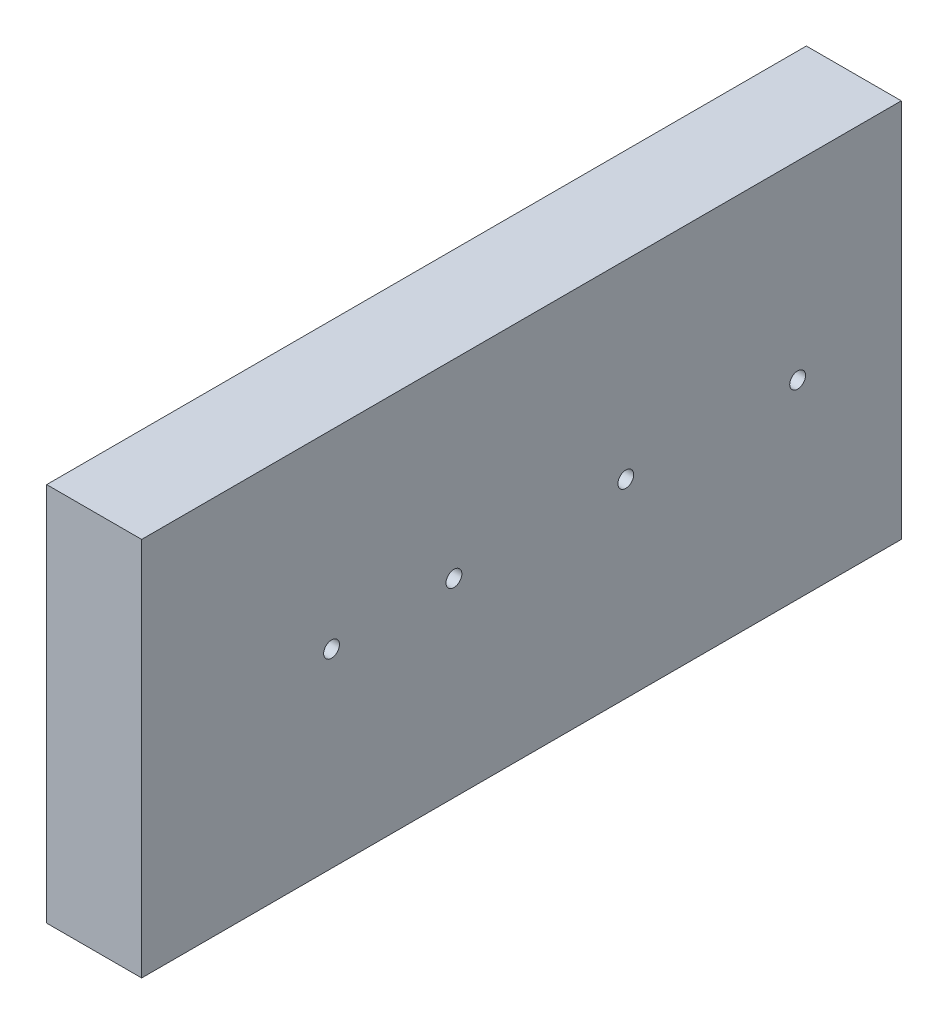
ISO-10303-21;
HEADER;
FILE_DESCRIPTION(('STEP AP214'),'2;1');
FILE_NAME('part.step','',(''),(''),'','','');
FILE_SCHEMA(('AUTOMOTIVE_DESIGN { 1 0 10303 214 1 1 1 1 }'));
ENDSEC;
DATA;
#1=APPLICATION_CONTEXT('core data for automotive mechanical design processes');
#2=APPLICATION_PROTOCOL_DEFINITION('international standard','automotive_design',2000,#1);
#3=PRODUCT_CONTEXT('',#1,'mechanical');
#4=PRODUCT('Part','Part','',(#3));
#5=PRODUCT_RELATED_PRODUCT_CATEGORY('part','',(#4));
#6=PRODUCT_DEFINITION_FORMATION('','',#4);
#7=PRODUCT_DEFINITION_CONTEXT('part definition',#1,'design');
#8=PRODUCT_DEFINITION('design','',#6,#7);
#9=PRODUCT_DEFINITION_SHAPE('','',#8);
#10=(LENGTH_UNIT() NAMED_UNIT(*) SI_UNIT(.MILLI.,.METRE.));
#11=(NAMED_UNIT(*) PLANE_ANGLE_UNIT() SI_UNIT($,.RADIAN.));
#12=(NAMED_UNIT(*) SI_UNIT($,.STERADIAN.) SOLID_ANGLE_UNIT());
#13=UNCERTAINTY_MEASURE_WITH_UNIT(LENGTH_MEASURE(1.E-05),#10,'distance_accuracy_value','');
#14=(GEOMETRIC_REPRESENTATION_CONTEXT(3) GLOBAL_UNCERTAINTY_ASSIGNED_CONTEXT((#13)) GLOBAL_UNIT_ASSIGNED_CONTEXT((#10,
#11,#12)) REPRESENTATION_CONTEXT('',''));
#15=CARTESIAN_POINT('',(0.,0.,0.));
#16=DIRECTION('',(0.,0.,1.));
#17=DIRECTION('',(1.,0.,0.));
#18=AXIS2_PLACEMENT_3D('',#15,#16,#17);
#19=CARTESIAN_POINT('',(19.05,0.,-20.927));
#20=DIRECTION('',(-1.,0.,0.));
#21=DIRECTION('',(0.,0.,1.));
#22=AXIS2_PLACEMENT_3D('',#19,#20,#21);
#23=CYLINDRICAL_SURFACE('',#22,1.5875);
#24=CARTESIAN_POINT('',(19.05,0.,-20.927));
#25=DIRECTION('',(1.,0.,0.));
#26=DIRECTION('',(0.,0.,-1.));
#27=AXIS2_PLACEMENT_3D('',#24,#25,#26);
#28=CIRCLE('',#27,1.5875);
#29=CARTESIAN_POINT('',(19.05,0.,-19.3395));
#30=VERTEX_POINT('',#29);
#31=EDGE_CURVE('E206',#30,#30,#28,.T.);
#32=CARTESIAN_POINT('',(6.35,0.,-20.927));
#33=DIRECTION('',(-1.,0.,0.));
#34=DIRECTION('',(0.,0.,1.));
#35=AXIS2_PLACEMENT_3D('',#32,#33,#34);
#36=CIRCLE('',#35,1.5875);
#37=CARTESIAN_POINT('',(6.35,0.,-19.3395));
#38=VERTEX_POINT('',#37);
#39=EDGE_CURVE('E55',#38,#38,#36,.T.);
#40=CARTESIAN_POINT('',(19.05,0.,-19.3395));
#41=CARTESIAN_POINT('',(18.9177083333333,0.,-19.3395));
#42=CARTESIAN_POINT('',(18.7854166666667,0.,-19.3395));
#43=CARTESIAN_POINT('',(18.5208333333333,0.,-19.3395));
#44=CARTESIAN_POINT('',(18.3885416666667,0.,-19.3395));
#45=CARTESIAN_POINT('',(18.1239583333333,0.,-19.3395));
#46=CARTESIAN_POINT('',(17.9916666666667,0.,-19.3395));
#47=CARTESIAN_POINT('',(17.7270833333333,0.,-19.3395));
#48=CARTESIAN_POINT('',(17.5947916666667,0.,-19.3395));
#49=CARTESIAN_POINT('',(17.3302083333333,0.,-19.3395));
#50=CARTESIAN_POINT('',(17.1979166666667,0.,-19.3395));
#51=CARTESIAN_POINT('',(16.9333333333333,0.,-19.3395));
#52=CARTESIAN_POINT('',(16.8010416666667,0.,-19.3395));
#53=CARTESIAN_POINT('',(16.5364583333333,0.,-19.3395));
#54=CARTESIAN_POINT('',(16.4041666666667,0.,-19.3395));
#55=CARTESIAN_POINT('',(16.1395833333333,0.,-19.3395));
#56=CARTESIAN_POINT('',(16.0072916666667,0.,-19.3395));
#57=CARTESIAN_POINT('',(15.7427083333333,0.,-19.3395));
#58=CARTESIAN_POINT('',(15.6104166666667,0.,-19.3395));
#59=CARTESIAN_POINT('',(15.3458333333333,0.,-19.3395));
#60=CARTESIAN_POINT('',(15.2135416666667,0.,-19.3395));
#61=CARTESIAN_POINT('',(14.9489583333333,0.,-19.3395));
#62=CARTESIAN_POINT('',(14.8166666666667,0.,-19.3395));
#63=CARTESIAN_POINT('',(14.5520833333333,0.,-19.3395));
#64=CARTESIAN_POINT('',(14.4197916666667,0.,-19.3395));
#65=CARTESIAN_POINT('',(14.1552083333333,0.,-19.3395));
#66=CARTESIAN_POINT('',(14.0229166666667,0.,-19.3395));
#67=CARTESIAN_POINT('',(13.7583333333333,0.,-19.3395));
#68=CARTESIAN_POINT('',(13.6260416666667,0.,-19.3395));
#69=CARTESIAN_POINT('',(13.3614583333333,0.,-19.3395));
#70=CARTESIAN_POINT('',(13.2291666666667,0.,-19.3395));
#71=CARTESIAN_POINT('',(12.9645833333333,0.,-19.3395));
#72=CARTESIAN_POINT('',(12.8322916666667,0.,-19.3395));
#73=CARTESIAN_POINT('',(12.5677083333333,0.,-19.3395));
#74=CARTESIAN_POINT('',(12.4354166666667,0.,-19.3395));
#75=CARTESIAN_POINT('',(12.1708333333333,0.,-19.3395));
#76=CARTESIAN_POINT('',(12.0385416666667,0.,-19.3395));
#77=CARTESIAN_POINT('',(11.7739583333333,0.,-19.3395));
#78=CARTESIAN_POINT('',(11.6416666666667,0.,-19.3395));
#79=CARTESIAN_POINT('',(11.3770833333333,0.,-19.3395));
#80=CARTESIAN_POINT('',(11.2447916666667,0.,-19.3395));
#81=CARTESIAN_POINT('',(10.9802083333333,0.,-19.3395));
#82=CARTESIAN_POINT('',(10.8479166666667,0.,-19.3395));
#83=CARTESIAN_POINT('',(10.5833333333333,0.,-19.3395));
#84=CARTESIAN_POINT('',(10.4510416666667,0.,-19.3395));
#85=CARTESIAN_POINT('',(10.1864583333333,0.,-19.3395));
#86=CARTESIAN_POINT('',(10.0541666666667,0.,-19.3395));
#87=CARTESIAN_POINT('',(9.78958333333333,0.,-19.3395));
#88=CARTESIAN_POINT('',(9.65729166666667,0.,-19.3395));
#89=CARTESIAN_POINT('',(9.39270833333333,0.,-19.3395));
#90=CARTESIAN_POINT('',(9.26041666666667,0.,-19.3395));
#91=CARTESIAN_POINT('',(8.99583333333333,0.,-19.3395));
#92=CARTESIAN_POINT('',(8.86354166666667,0.,-19.3395));
#93=CARTESIAN_POINT('',(8.59895833333333,0.,-19.3395));
#94=CARTESIAN_POINT('',(8.46666666666667,0.,-19.3395));
#95=CARTESIAN_POINT('',(8.20208333333333,0.,-19.3395));
#96=CARTESIAN_POINT('',(8.06979166666667,0.,-19.3395));
#97=CARTESIAN_POINT('',(7.80520833333333,0.,-19.3395));
#98=CARTESIAN_POINT('',(7.67291666666667,0.,-19.3395));
#99=CARTESIAN_POINT('',(7.40833333333333,0.,-19.3395));
#100=CARTESIAN_POINT('',(7.27604166666667,0.,-19.3395));
#101=CARTESIAN_POINT('',(7.01145833333333,0.,-19.3395));
#102=CARTESIAN_POINT('',(6.87916666666667,0.,-19.3395));
#103=CARTESIAN_POINT('',(6.61458333333333,0.,-19.3395));
#104=CARTESIAN_POINT('',(6.48229166666667,0.,-19.3395));
#105=CARTESIAN_POINT('',(6.35,0.,-19.3395));
#106=B_SPLINE_CURVE_WITH_KNOTS('',3,(#40,#41,#42,#43,#44,#45,#46,#47,#48,#49,#50,#51,#52,#53,
#54,#55,#56,#57,#58,#59,#60,#61,#62,#63,#64,#65,#66,#67,#68,#69,#70,#71,#72,#73,#74,#75,#76,#77,
#78,#79,#80,#81,#82,#83,#84,#85,#86,#87,#88,#89,#90,#91,#92,#93,#94,#95,#96,#97,#98,#99,#100,
#101,#102,#103,#104,#105),.UNSPECIFIED.,.F.,.F.,(4,2,2,2,2,2,2,2,2,2,2,2,2,2,2,2,2,2,2,2,2,2,2,
2,2,2,2,2,2,2,2,2,4),(0.,0.396875000000001,0.793750000000003,1.190625,1.5875,1.984375,2.38125,
2.778125,3.175,3.571875,3.96875,4.365625,4.7625,5.159375,5.55625,5.953125,6.35,6.746875,7.14375,
7.540625,7.9375,8.334375,8.73125,9.128125,9.525,9.921875,10.31875,10.715625,11.1125,11.509375,
11.90625,12.303125,12.7),.UNSPECIFIED.);
#107=EDGE_CURVE('BSEAM51',#30,#38,#106,.T.);
#108=ORIENTED_EDGE('',*,*,#31,.T.);
#109=ORIENTED_EDGE('',*,*,#39,.T.);
#110=ORIENTED_EDGE('',*,*,#107,.T.);
#111=ORIENTED_EDGE('',*,*,#107,.F.);
#112=EDGE_LOOP('',(#108,#110,#109,#111));
#113=FACE_BOUND('',#112,.T.);
#114=ADVANCED_FACE('F51',(#113),#23,.F.);
#115=CARTESIAN_POINT('',(19.05,0.,13.55));
#116=DIRECTION('',(-1.,0.,0.));
#117=DIRECTION('',(0.,0.,1.));
#118=AXIS2_PLACEMENT_3D('',#115,#116,#117);
#119=CYLINDRICAL_SURFACE('',#118,1.5875);
#120=CARTESIAN_POINT('',(19.05,0.,13.55));
#121=DIRECTION('',(1.,0.,0.));
#122=DIRECTION('',(0.,0.,-1.));
#123=AXIS2_PLACEMENT_3D('',#120,#121,#122);
#124=CIRCLE('',#123,1.5875);
#125=CARTESIAN_POINT('',(19.05,0.,15.1375));
#126=VERTEX_POINT('',#125);
#127=EDGE_CURVE('E202',#126,#126,#124,.T.);
#128=CARTESIAN_POINT('',(6.35,0.,13.55));
#129=DIRECTION('',(-1.,0.,0.));
#130=DIRECTION('',(0.,0.,1.));
#131=AXIS2_PLACEMENT_3D('',#128,#129,#130);
#132=CIRCLE('',#131,1.5875);
#133=CARTESIAN_POINT('',(6.35,0.,15.1375));
#134=VERTEX_POINT('',#133);
#135=EDGE_CURVE('E240',#134,#134,#132,.T.);
#136=CARTESIAN_POINT('',(19.05,0.,15.1375));
#137=CARTESIAN_POINT('',(18.9177083333333,0.,15.1375));
#138=CARTESIAN_POINT('',(18.7854166666667,0.,15.1375));
#139=CARTESIAN_POINT('',(18.5208333333333,0.,15.1375));
#140=CARTESIAN_POINT('',(18.3885416666667,0.,15.1375));
#141=CARTESIAN_POINT('',(18.1239583333333,0.,15.1375));
#142=CARTESIAN_POINT('',(17.9916666666667,0.,15.1375));
#143=CARTESIAN_POINT('',(17.7270833333333,0.,15.1375));
#144=CARTESIAN_POINT('',(17.5947916666667,0.,15.1375));
#145=CARTESIAN_POINT('',(17.3302083333333,0.,15.1375));
#146=CARTESIAN_POINT('',(17.1979166666667,0.,15.1375));
#147=CARTESIAN_POINT('',(16.9333333333333,0.,15.1375));
#148=CARTESIAN_POINT('',(16.8010416666667,0.,15.1375));
#149=CARTESIAN_POINT('',(16.5364583333333,0.,15.1375));
#150=CARTESIAN_POINT('',(16.4041666666667,0.,15.1375));
#151=CARTESIAN_POINT('',(16.1395833333333,0.,15.1375));
#152=CARTESIAN_POINT('',(16.0072916666667,0.,15.1375));
#153=CARTESIAN_POINT('',(15.7427083333333,0.,15.1375));
#154=CARTESIAN_POINT('',(15.6104166666667,0.,15.1375));
#155=CARTESIAN_POINT('',(15.3458333333333,0.,15.1375));
#156=CARTESIAN_POINT('',(15.2135416666667,0.,15.1375));
#157=CARTESIAN_POINT('',(14.9489583333333,0.,15.1375));
#158=CARTESIAN_POINT('',(14.8166666666667,0.,15.1375));
#159=CARTESIAN_POINT('',(14.5520833333333,0.,15.1375));
#160=CARTESIAN_POINT('',(14.4197916666667,0.,15.1375));
#161=CARTESIAN_POINT('',(14.1552083333333,0.,15.1375));
#162=CARTESIAN_POINT('',(14.0229166666667,0.,15.1375));
#163=CARTESIAN_POINT('',(13.7583333333333,0.,15.1375));
#164=CARTESIAN_POINT('',(13.6260416666667,0.,15.1375));
#165=CARTESIAN_POINT('',(13.3614583333333,0.,15.1375));
#166=CARTESIAN_POINT('',(13.2291666666667,0.,15.1375));
#167=CARTESIAN_POINT('',(12.9645833333333,0.,15.1375));
#168=CARTESIAN_POINT('',(12.8322916666667,0.,15.1375));
#169=CARTESIAN_POINT('',(12.5677083333333,0.,15.1375));
#170=CARTESIAN_POINT('',(12.4354166666667,0.,15.1375));
#171=CARTESIAN_POINT('',(12.1708333333333,0.,15.1375));
#172=CARTESIAN_POINT('',(12.0385416666667,0.,15.1375));
#173=CARTESIAN_POINT('',(11.7739583333333,0.,15.1375));
#174=CARTESIAN_POINT('',(11.6416666666667,0.,15.1375));
#175=CARTESIAN_POINT('',(11.3770833333333,0.,15.1375));
#176=CARTESIAN_POINT('',(11.2447916666667,0.,15.1375));
#177=CARTESIAN_POINT('',(10.9802083333333,0.,15.1375));
#178=CARTESIAN_POINT('',(10.8479166666667,0.,15.1375));
#179=CARTESIAN_POINT('',(10.5833333333333,0.,15.1375));
#180=CARTESIAN_POINT('',(10.4510416666667,0.,15.1375));
#181=CARTESIAN_POINT('',(10.1864583333333,0.,15.1375));
#182=CARTESIAN_POINT('',(10.0541666666667,0.,15.1375));
#183=CARTESIAN_POINT('',(9.78958333333333,0.,15.1375));
#184=CARTESIAN_POINT('',(9.65729166666667,0.,15.1375));
#185=CARTESIAN_POINT('',(9.39270833333333,0.,15.1375));
#186=CARTESIAN_POINT('',(9.26041666666667,0.,15.1375));
#187=CARTESIAN_POINT('',(8.99583333333333,0.,15.1375));
#188=CARTESIAN_POINT('',(8.86354166666667,0.,15.1375));
#189=CARTESIAN_POINT('',(8.59895833333333,0.,15.1375));
#190=CARTESIAN_POINT('',(8.46666666666667,0.,15.1375));
#191=CARTESIAN_POINT('',(8.20208333333333,0.,15.1375));
#192=CARTESIAN_POINT('',(8.06979166666667,0.,15.1375));
#193=CARTESIAN_POINT('',(7.80520833333333,0.,15.1375));
#194=CARTESIAN_POINT('',(7.67291666666667,0.,15.1375));
#195=CARTESIAN_POINT('',(7.40833333333333,0.,15.1375));
#196=CARTESIAN_POINT('',(7.27604166666667,0.,15.1375));
#197=CARTESIAN_POINT('',(7.01145833333333,0.,15.1375));
#198=CARTESIAN_POINT('',(6.87916666666667,0.,15.1375));
#199=CARTESIAN_POINT('',(6.61458333333333,0.,15.1375));
#200=CARTESIAN_POINT('',(6.48229166666667,0.,15.1375));
#201=CARTESIAN_POINT('',(6.35,0.,15.1375));
#202=B_SPLINE_CURVE_WITH_KNOTS('',3,(#136,#137,#138,#139,#140,#141,#142,#143,#144,#145,#146,
#147,#148,#149,#150,#151,#152,#153,#154,#155,#156,#157,#158,#159,#160,#161,#162,#163,#164,#165,
#166,#167,#168,#169,#170,#171,#172,#173,#174,#175,#176,#177,#178,#179,#180,#181,#182,#183,#184,
#185,#186,#187,#188,#189,#190,#191,#192,#193,#194,#195,#196,#197,#198,#199,#200,#201),
.UNSPECIFIED.,.F.,.F.,(4,2,2,2,2,2,2,2,2,2,2,2,2,2,2,2,2,2,2,2,2,2,2,2,2,2,2,2,2,2,2,2,4),(0.,
0.396875000000001,0.793750000000003,1.190625,1.5875,1.984375,2.38125,2.778125,3.175,3.571875,
3.96875,4.365625,4.7625,5.159375,5.55625,5.953125,6.35,6.746875,7.14375,7.540625,7.9375,
8.334375,8.73125,9.128125,9.525,9.921875,10.31875,10.715625,11.1125,11.509375,11.90625,
12.303125,12.7),.UNSPECIFIED.);
#203=EDGE_CURVE('BSEAM288',#126,#134,#202,.T.);
#204=ORIENTED_EDGE('',*,*,#127,.T.);
#205=ORIENTED_EDGE('',*,*,#135,.T.);
#206=ORIENTED_EDGE('',*,*,#203,.T.);
#207=ORIENTED_EDGE('',*,*,#203,.F.);
#208=EDGE_LOOP('',(#204,#206,#205,#207));
#209=FACE_BOUND('',#208,.T.);
#210=ADVANCED_FACE('F288',(#209),#119,.F.);
#211=CARTESIAN_POINT('',(19.05,0.,38.1));
#212=DIRECTION('',(-1.,0.,0.));
#213=DIRECTION('',(0.,0.,1.));
#214=AXIS2_PLACEMENT_3D('',#211,#212,#213);
#215=CYLINDRICAL_SURFACE('',#214,1.5875);
#216=CARTESIAN_POINT('',(19.05,0.,38.1));
#217=DIRECTION('',(1.,0.,0.));
#218=DIRECTION('',(0.,0.,-1.));
#219=AXIS2_PLACEMENT_3D('',#216,#217,#218);
#220=CIRCLE('',#219,1.5875);
#221=CARTESIAN_POINT('',(19.05,0.,39.6875));
#222=VERTEX_POINT('',#221);
#223=EDGE_CURVE('E198',#222,#222,#220,.T.);
#224=CARTESIAN_POINT('',(6.35,0.,38.1));
#225=DIRECTION('',(-1.,0.,0.));
#226=DIRECTION('',(0.,0.,1.));
#227=AXIS2_PLACEMENT_3D('',#224,#225,#226);
#228=CIRCLE('',#227,1.5875);
#229=CARTESIAN_POINT('',(6.35,0.,39.6875));
#230=VERTEX_POINT('',#229);
#231=EDGE_CURVE('E237',#230,#230,#228,.T.);
#232=CARTESIAN_POINT('',(19.05,0.,39.6875));
#233=CARTESIAN_POINT('',(18.9177083333333,0.,39.6875));
#234=CARTESIAN_POINT('',(18.7854166666667,0.,39.6875));
#235=CARTESIAN_POINT('',(18.5208333333333,0.,39.6875));
#236=CARTESIAN_POINT('',(18.3885416666667,0.,39.6875));
#237=CARTESIAN_POINT('',(18.1239583333333,0.,39.6875));
#238=CARTESIAN_POINT('',(17.9916666666667,0.,39.6875));
#239=CARTESIAN_POINT('',(17.7270833333333,0.,39.6875));
#240=CARTESIAN_POINT('',(17.5947916666667,0.,39.6875));
#241=CARTESIAN_POINT('',(17.3302083333333,0.,39.6875));
#242=CARTESIAN_POINT('',(17.1979166666667,0.,39.6875));
#243=CARTESIAN_POINT('',(16.9333333333333,0.,39.6875));
#244=CARTESIAN_POINT('',(16.8010416666667,0.,39.6875));
#245=CARTESIAN_POINT('',(16.5364583333333,0.,39.6875));
#246=CARTESIAN_POINT('',(16.4041666666667,0.,39.6875));
#247=CARTESIAN_POINT('',(16.1395833333333,0.,39.6875));
#248=CARTESIAN_POINT('',(16.0072916666667,0.,39.6875));
#249=CARTESIAN_POINT('',(15.7427083333333,0.,39.6875));
#250=CARTESIAN_POINT('',(15.6104166666667,0.,39.6875));
#251=CARTESIAN_POINT('',(15.3458333333333,0.,39.6875));
#252=CARTESIAN_POINT('',(15.2135416666667,0.,39.6875));
#253=CARTESIAN_POINT('',(14.9489583333333,0.,39.6875));
#254=CARTESIAN_POINT('',(14.8166666666667,0.,39.6875));
#255=CARTESIAN_POINT('',(14.5520833333333,0.,39.6875));
#256=CARTESIAN_POINT('',(14.4197916666667,0.,39.6875));
#257=CARTESIAN_POINT('',(14.1552083333333,0.,39.6875));
#258=CARTESIAN_POINT('',(14.0229166666667,0.,39.6875));
#259=CARTESIAN_POINT('',(13.7583333333333,0.,39.6875));
#260=CARTESIAN_POINT('',(13.6260416666667,0.,39.6875));
#261=CARTESIAN_POINT('',(13.3614583333333,0.,39.6875));
#262=CARTESIAN_POINT('',(13.2291666666667,0.,39.6875));
#263=CARTESIAN_POINT('',(12.9645833333333,0.,39.6875));
#264=CARTESIAN_POINT('',(12.8322916666667,0.,39.6875));
#265=CARTESIAN_POINT('',(12.5677083333333,0.,39.6875));
#266=CARTESIAN_POINT('',(12.4354166666667,0.,39.6875));
#267=CARTESIAN_POINT('',(12.1708333333333,0.,39.6875));
#268=CARTESIAN_POINT('',(12.0385416666667,0.,39.6875));
#269=CARTESIAN_POINT('',(11.7739583333333,0.,39.6875));
#270=CARTESIAN_POINT('',(11.6416666666667,0.,39.6875));
#271=CARTESIAN_POINT('',(11.3770833333333,0.,39.6875));
#272=CARTESIAN_POINT('',(11.2447916666667,0.,39.6875));
#273=CARTESIAN_POINT('',(10.9802083333333,0.,39.6875));
#274=CARTESIAN_POINT('',(10.8479166666667,0.,39.6875));
#275=CARTESIAN_POINT('',(10.5833333333333,0.,39.6875));
#276=CARTESIAN_POINT('',(10.4510416666667,0.,39.6875));
#277=CARTESIAN_POINT('',(10.1864583333333,0.,39.6875));
#278=CARTESIAN_POINT('',(10.0541666666667,0.,39.6875));
#279=CARTESIAN_POINT('',(9.78958333333333,0.,39.6875));
#280=CARTESIAN_POINT('',(9.65729166666667,0.,39.6875));
#281=CARTESIAN_POINT('',(9.39270833333333,0.,39.6875));
#282=CARTESIAN_POINT('',(9.26041666666667,0.,39.6875));
#283=CARTESIAN_POINT('',(8.99583333333333,0.,39.6875));
#284=CARTESIAN_POINT('',(8.86354166666667,0.,39.6875));
#285=CARTESIAN_POINT('',(8.59895833333333,0.,39.6875));
#286=CARTESIAN_POINT('',(8.46666666666667,0.,39.6875));
#287=CARTESIAN_POINT('',(8.20208333333333,0.,39.6875));
#288=CARTESIAN_POINT('',(8.06979166666667,0.,39.6875));
#289=CARTESIAN_POINT('',(7.80520833333333,0.,39.6875));
#290=CARTESIAN_POINT('',(7.67291666666667,0.,39.6875));
#291=CARTESIAN_POINT('',(7.40833333333333,0.,39.6875));
#292=CARTESIAN_POINT('',(7.27604166666667,0.,39.6875));
#293=CARTESIAN_POINT('',(7.01145833333333,0.,39.6875));
#294=CARTESIAN_POINT('',(6.87916666666667,0.,39.6875));
#295=CARTESIAN_POINT('',(6.61458333333333,0.,39.6875));
#296=CARTESIAN_POINT('',(6.48229166666667,0.,39.6875));
#297=CARTESIAN_POINT('',(6.35,0.,39.6875));
#298=B_SPLINE_CURVE_WITH_KNOTS('',3,(#232,#233,#234,#235,#236,#237,#238,#239,#240,#241,#242,
#243,#244,#245,#246,#247,#248,#249,#250,#251,#252,#253,#254,#255,#256,#257,#258,#259,#260,#261,
#262,#263,#264,#265,#266,#267,#268,#269,#270,#271,#272,#273,#274,#275,#276,#277,#278,#279,#280,
#281,#282,#283,#284,#285,#286,#287,#288,#289,#290,#291,#292,#293,#294,#295,#296,#297),
.UNSPECIFIED.,.F.,.F.,(4,2,2,2,2,2,2,2,2,2,2,2,2,2,2,2,2,2,2,2,2,2,2,2,2,2,2,2,2,2,2,2,4),(0.,
0.396875000000001,0.793750000000003,1.190625,1.5875,1.984375,2.38125,2.778125,3.175,3.571875,
3.96875,4.365625,4.7625,5.159375,5.55625,5.953125,6.35,6.746875,7.14375,7.540625,7.9375,
8.334375,8.73125,9.128125,9.525,9.921875,10.31875,10.715625,11.1125,11.509375,11.90625,
12.303125,12.7),.UNSPECIFIED.);
#299=EDGE_CURVE('BSEAM295',#222,#230,#298,.T.);
#300=ORIENTED_EDGE('',*,*,#223,.T.);
#301=ORIENTED_EDGE('',*,*,#231,.T.);
#302=ORIENTED_EDGE('',*,*,#299,.T.);
#303=ORIENTED_EDGE('',*,*,#299,.F.);
#304=EDGE_LOOP('',(#300,#302,#301,#303));
#305=FACE_BOUND('',#304,.T.);
#306=ADVANCED_FACE('F295',(#305),#215,.F.);
#307=CARTESIAN_POINT('',(19.05,0.,-55.404));
#308=DIRECTION('',(-1.,0.,0.));
#309=DIRECTION('',(0.,0.,1.));
#310=AXIS2_PLACEMENT_3D('',#307,#308,#309);
#311=CYLINDRICAL_SURFACE('',#310,1.5875);
#312=CARTESIAN_POINT('',(19.05,0.,-55.404));
#313=DIRECTION('',(1.,0.,0.));
#314=DIRECTION('',(0.,0.,-1.));
#315=AXIS2_PLACEMENT_3D('',#312,#313,#314);
#316=CIRCLE('',#315,1.5875);
#317=CARTESIAN_POINT('',(19.05,0.,-53.8165));
#318=VERTEX_POINT('',#317);
#319=EDGE_CURVE('E210',#318,#318,#316,.T.);
#320=CARTESIAN_POINT('',(6.35,0.,-55.404));
#321=DIRECTION('',(-1.,0.,0.));
#322=DIRECTION('',(0.,0.,1.));
#323=AXIS2_PLACEMENT_3D('',#320,#321,#322);
#324=CIRCLE('',#323,1.5875);
#325=CARTESIAN_POINT('',(6.35,0.,-53.8165));
#326=VERTEX_POINT('',#325);
#327=EDGE_CURVE('E157',#326,#326,#324,.T.);
#328=CARTESIAN_POINT('',(19.05,0.,-53.8165));
#329=CARTESIAN_POINT('',(18.9177083333333,0.,-53.8165));
#330=CARTESIAN_POINT('',(18.7854166666667,0.,-53.8165));
#331=CARTESIAN_POINT('',(18.5208333333333,0.,-53.8165));
#332=CARTESIAN_POINT('',(18.3885416666667,0.,-53.8165));
#333=CARTESIAN_POINT('',(18.1239583333333,0.,-53.8165));
#334=CARTESIAN_POINT('',(17.9916666666667,0.,-53.8165));
#335=CARTESIAN_POINT('',(17.7270833333333,0.,-53.8165));
#336=CARTESIAN_POINT('',(17.5947916666667,0.,-53.8165));
#337=CARTESIAN_POINT('',(17.3302083333333,0.,-53.8165));
#338=CARTESIAN_POINT('',(17.1979166666667,0.,-53.8165));
#339=CARTESIAN_POINT('',(16.9333333333333,0.,-53.8165));
#340=CARTESIAN_POINT('',(16.8010416666667,0.,-53.8165));
#341=CARTESIAN_POINT('',(16.5364583333333,0.,-53.8165));
#342=CARTESIAN_POINT('',(16.4041666666667,0.,-53.8165));
#343=CARTESIAN_POINT('',(16.1395833333333,0.,-53.8165));
#344=CARTESIAN_POINT('',(16.0072916666667,0.,-53.8165));
#345=CARTESIAN_POINT('',(15.7427083333333,0.,-53.8165));
#346=CARTESIAN_POINT('',(15.6104166666667,0.,-53.8165));
#347=CARTESIAN_POINT('',(15.3458333333333,0.,-53.8165));
#348=CARTESIAN_POINT('',(15.2135416666667,0.,-53.8165));
#349=CARTESIAN_POINT('',(14.9489583333333,0.,-53.8165));
#350=CARTESIAN_POINT('',(14.8166666666667,0.,-53.8165));
#351=CARTESIAN_POINT('',(14.5520833333333,0.,-53.8165));
#352=CARTESIAN_POINT('',(14.4197916666667,0.,-53.8165));
#353=CARTESIAN_POINT('',(14.1552083333333,0.,-53.8165));
#354=CARTESIAN_POINT('',(14.0229166666667,0.,-53.8165));
#355=CARTESIAN_POINT('',(13.7583333333333,0.,-53.8165));
#356=CARTESIAN_POINT('',(13.6260416666667,0.,-53.8165));
#357=CARTESIAN_POINT('',(13.3614583333333,0.,-53.8165));
#358=CARTESIAN_POINT('',(13.2291666666667,0.,-53.8165));
#359=CARTESIAN_POINT('',(12.9645833333333,0.,-53.8165));
#360=CARTESIAN_POINT('',(12.8322916666667,0.,-53.8165));
#361=CARTESIAN_POINT('',(12.5677083333333,0.,-53.8165));
#362=CARTESIAN_POINT('',(12.4354166666667,0.,-53.8165));
#363=CARTESIAN_POINT('',(12.1708333333333,0.,-53.8165));
#364=CARTESIAN_POINT('',(12.0385416666667,0.,-53.8165));
#365=CARTESIAN_POINT('',(11.7739583333333,0.,-53.8165));
#366=CARTESIAN_POINT('',(11.6416666666667,0.,-53.8165));
#367=CARTESIAN_POINT('',(11.3770833333333,0.,-53.8165));
#368=CARTESIAN_POINT('',(11.2447916666667,0.,-53.8165));
#369=CARTESIAN_POINT('',(10.9802083333333,0.,-53.8165));
#370=CARTESIAN_POINT('',(10.8479166666667,0.,-53.8165));
#371=CARTESIAN_POINT('',(10.5833333333333,0.,-53.8165));
#372=CARTESIAN_POINT('',(10.4510416666667,0.,-53.8165));
#373=CARTESIAN_POINT('',(10.1864583333333,0.,-53.8165));
#374=CARTESIAN_POINT('',(10.0541666666667,0.,-53.8165));
#375=CARTESIAN_POINT('',(9.78958333333333,0.,-53.8165));
#376=CARTESIAN_POINT('',(9.65729166666667,0.,-53.8165));
#377=CARTESIAN_POINT('',(9.39270833333333,0.,-53.8165));
#378=CARTESIAN_POINT('',(9.26041666666667,0.,-53.8165));
#379=CARTESIAN_POINT('',(8.99583333333333,0.,-53.8165));
#380=CARTESIAN_POINT('',(8.86354166666667,0.,-53.8165));
#381=CARTESIAN_POINT('',(8.59895833333333,0.,-53.8165));
#382=CARTESIAN_POINT('',(8.46666666666667,0.,-53.8165));
#383=CARTESIAN_POINT('',(8.20208333333333,0.,-53.8165));
#384=CARTESIAN_POINT('',(8.06979166666667,0.,-53.8165));
#385=CARTESIAN_POINT('',(7.80520833333333,0.,-53.8165));
#386=CARTESIAN_POINT('',(7.67291666666667,0.,-53.8165));
#387=CARTESIAN_POINT('',(7.40833333333333,0.,-53.8165));
#388=CARTESIAN_POINT('',(7.27604166666667,0.,-53.8165));
#389=CARTESIAN_POINT('',(7.01145833333333,0.,-53.8165));
#390=CARTESIAN_POINT('',(6.87916666666667,0.,-53.8165));
#391=CARTESIAN_POINT('',(6.61458333333333,0.,-53.8165));
#392=CARTESIAN_POINT('',(6.48229166666667,0.,-53.8165));
#393=CARTESIAN_POINT('',(6.35,0.,-53.8165));
#394=B_SPLINE_CURVE_WITH_KNOTS('',3,(#328,#329,#330,#331,#332,#333,#334,#335,#336,#337,#338,
#339,#340,#341,#342,#343,#344,#345,#346,#347,#348,#349,#350,#351,#352,#353,#354,#355,#356,#357,
#358,#359,#360,#361,#362,#363,#364,#365,#366,#367,#368,#369,#370,#371,#372,#373,#374,#375,#376,
#377,#378,#379,#380,#381,#382,#383,#384,#385,#386,#387,#388,#389,#390,#391,#392,#393),
.UNSPECIFIED.,.F.,.F.,(4,2,2,2,2,2,2,2,2,2,2,2,2,2,2,2,2,2,2,2,2,2,2,2,2,2,2,2,2,2,2,2,4),(0.,
0.396875000000001,0.793750000000003,1.190625,1.5875,1.984375,2.38125,2.778125,3.175,3.571875,
3.96875,4.365625,4.7625,5.159375,5.55625,5.953125,6.35,6.746875,7.14375,7.540625,7.9375,
8.334375,8.73125,9.128125,9.525,9.921875,10.31875,10.715625,11.1125,11.509375,11.90625,
12.303125,12.7),.UNSPECIFIED.);
#395=EDGE_CURVE('BSEAM299',#318,#326,#394,.T.);
#396=ORIENTED_EDGE('',*,*,#319,.T.);
#397=ORIENTED_EDGE('',*,*,#327,.T.);
#398=ORIENTED_EDGE('',*,*,#395,.T.);
#399=ORIENTED_EDGE('',*,*,#395,.F.);
#400=EDGE_LOOP('',(#396,#398,#397,#399));
#401=FACE_BOUND('',#400,.T.);
#402=ADVANCED_FACE('F299',(#401),#311,.F.);
#403=CARTESIAN_POINT('',(19.05,-38.1,0.));
#404=DIRECTION('',(0.,1.,0.));
#405=DIRECTION('',(0.,0.,1.));
#406=AXIS2_PLACEMENT_3D('',#403,#404,#405);
#407=PLANE('',#406);
#408=CARTESIAN_POINT('',(9.525,-38.1,0.));
#409=DIRECTION('',(0.,-1.,0.));
#410=DIRECTION('',(0.,0.,-1.));
#411=AXIS2_PLACEMENT_3D('',#408,#409,#410);
#412=CIRCLE('',#411,3.17499999999999);
#413=CARTESIAN_POINT('',(9.525,-38.1,-3.17499999999997));
#414=VERTEX_POINT('',#413);
#415=EDGE_CURVE('E131',#414,#414,#412,.T.);
#416=ORIENTED_EDGE('',*,*,#415,.F.);
#417=EDGE_LOOP('',(#416));
#418=FACE_BOUND('',#417,.T.);
#419=CARTESIAN_POINT('',(9.525,-38.1,57.15));
#420=DIRECTION('',(0.,-1.,0.));
#421=DIRECTION('',(0.,0.,-1.));
#422=AXIS2_PLACEMENT_3D('',#419,#420,#421);
#423=CIRCLE('',#422,3.17499999999999);
#424=CARTESIAN_POINT('',(9.525,-38.1,53.975));
#425=VERTEX_POINT('',#424);
#426=EDGE_CURVE('E130',#425,#425,#423,.T.);
#427=ORIENTED_EDGE('',*,*,#426,.F.);
#428=EDGE_LOOP('',(#427));
#429=FACE_BOUND('',#428,.T.);
#430=CARTESIAN_POINT('',(9.52500000000002,-38.1,-63.5));
#431=DIRECTION('',(0.,-1.,0.));
#432=DIRECTION('',(0.,0.,-1.));
#433=AXIS2_PLACEMENT_3D('',#430,#431,#432);
#434=CIRCLE('',#433,3.17499999999999);
#435=CARTESIAN_POINT('',(9.52500000000002,-38.1,-66.675));
#436=VERTEX_POINT('',#435);
#437=EDGE_CURVE('E144',#436,#436,#434,.T.);
#438=ORIENTED_EDGE('',*,*,#437,.F.);
#439=EDGE_LOOP('',(#438));
#440=FACE_BOUND('',#439,.T.);
#441=DIRECTION('',(0.,0.,-1.));
#442=VECTOR('',#441,1.);
#443=CARTESIAN_POINT('',(0.,-38.1,0.));
#444=LINE('',#443,#442);
#445=CARTESIAN_POINT('',(0.,-38.1,76.2));
#446=VERTEX_POINT('',#445);
#447=CARTESIAN_POINT('',(0.,-38.1,-76.2));
#448=VERTEX_POINT('',#447);
#449=EDGE_CURVE('E214',#446,#448,#444,.T.);
#450=ORIENTED_EDGE('',*,*,#449,.T.);
#451=DIRECTION('',(-1.,0.,0.));
#452=VECTOR('',#451,1.);
#453=CARTESIAN_POINT('',(19.05,-38.1,-76.2));
#454=LINE('',#453,#452);
#455=CARTESIAN_POINT('',(19.05,-38.1,-76.2));
#456=VERTEX_POINT('',#455);
#457=EDGE_CURVE('E11',#456,#448,#454,.T.);
#458=ORIENTED_EDGE('',*,*,#457,.F.);
#459=DIRECTION('',(0.,0.,-1.));
#460=VECTOR('',#459,1.);
#461=CARTESIAN_POINT('',(19.05,-38.1,0.));
#462=LINE('',#461,#460);
#463=CARTESIAN_POINT('',(19.05,-38.1,76.2));
#464=VERTEX_POINT('',#463);
#465=EDGE_CURVE('E185',#464,#456,#462,.T.);
#466=ORIENTED_EDGE('',*,*,#465,.F.);
#467=DIRECTION('',(-1.,0.,0.));
#468=VECTOR('',#467,1.);
#469=CARTESIAN_POINT('',(19.05,-38.1,76.2));
#470=LINE('',#469,#468);
#471=EDGE_CURVE('E74',#464,#446,#470,.T.);
#472=ORIENTED_EDGE('',*,*,#471,.T.);
#473=EDGE_LOOP('',(#450,#458,#466,#472));
#474=FACE_BOUND('',#473,.T.);
#475=ADVANCED_FACE('F53',(#418,#429,#440,#474),#407,.F.);
#476=CARTESIAN_POINT('',(19.05,0.,-76.2));
#477=DIRECTION('',(0.,0.,1.));
#478=DIRECTION('',(1.,0.,0.));
#479=AXIS2_PLACEMENT_3D('',#476,#477,#478);
#480=PLANE('',#479);
#481=DIRECTION('',(0.,1.,0.));
#482=VECTOR('',#481,1.);
#483=CARTESIAN_POINT('',(0.,0.,-76.2));
#484=LINE('',#483,#482);
#485=CARTESIAN_POINT('',(0.,38.1,-76.2));
#486=VERTEX_POINT('',#485);
#487=EDGE_CURVE('E217',#448,#486,#484,.T.);
#488=ORIENTED_EDGE('',*,*,#487,.T.);
#489=DIRECTION('',(-1.,0.,0.));
#490=VECTOR('',#489,1.);
#491=CARTESIAN_POINT('',(19.05,38.1,-76.2));
#492=LINE('',#491,#490);
#493=CARTESIAN_POINT('',(19.05,38.1,-76.2));
#494=VERTEX_POINT('',#493);
#495=EDGE_CURVE('E62',#494,#486,#492,.T.);
#496=ORIENTED_EDGE('',*,*,#495,.F.);
#497=DIRECTION('',(0.,1.,0.));
#498=VECTOR('',#497,1.);
#499=CARTESIAN_POINT('',(19.05,0.,-76.2));
#500=LINE('',#499,#498);
#501=EDGE_CURVE('E107',#456,#494,#500,.T.);
#502=ORIENTED_EDGE('',*,*,#501,.F.);
#503=ORIENTED_EDGE('',*,*,#457,.T.);
#504=EDGE_LOOP('',(#488,#496,#502,#503));
#505=FACE_BOUND('',#504,.T.);
#506=ADVANCED_FACE('F283',(#505),#480,.F.);
#507=CARTESIAN_POINT('',(19.05,38.1,0.));
#508=DIRECTION('',(0.,1.,0.));
#509=DIRECTION('',(0.,0.,1.));
#510=AXIS2_PLACEMENT_3D('',#507,#508,#509);
#511=PLANE('',#510);
#512=DIRECTION('',(0.,0.,-1.));
#513=VECTOR('',#512,1.);
#514=CARTESIAN_POINT('',(0.,38.1,0.));
#515=LINE('',#514,#513);
#516=CARTESIAN_POINT('',(0.,38.1,76.2));
#517=VERTEX_POINT('',#516);
#518=EDGE_CURVE('E221',#517,#486,#515,.T.);
#519=ORIENTED_EDGE('',*,*,#518,.F.);
#520=DIRECTION('',(-1.,0.,0.));
#521=VECTOR('',#520,1.);
#522=CARTESIAN_POINT('',(19.05,38.1,76.2));
#523=LINE('',#522,#521);
#524=CARTESIAN_POINT('',(19.05,38.1,76.2));
#525=VERTEX_POINT('',#524);
#526=EDGE_CURVE('E93',#525,#517,#523,.T.);
#527=ORIENTED_EDGE('',*,*,#526,.F.);
#528=DIRECTION('',(0.,0.,-1.));
#529=VECTOR('',#528,1.);
#530=CARTESIAN_POINT('',(19.05,38.1,0.));
#531=LINE('',#530,#529);
#532=EDGE_CURVE('E191',#525,#494,#531,.T.);
#533=ORIENTED_EDGE('',*,*,#532,.T.);
#534=ORIENTED_EDGE('',*,*,#495,.T.);
#535=EDGE_LOOP('',(#519,#527,#533,#534));
#536=FACE_BOUND('',#535,.T.);
#537=ADVANCED_FACE('F276',(#536),#511,.T.);
#538=CARTESIAN_POINT('',(19.05,0.,76.2));
#539=DIRECTION('',(0.,0.,1.));
#540=DIRECTION('',(1.,0.,0.));
#541=AXIS2_PLACEMENT_3D('',#538,#539,#540);
#542=PLANE('',#541);
#543=DIRECTION('',(0.,1.,0.));
#544=VECTOR('',#543,1.);
#545=CARTESIAN_POINT('',(0.,0.,76.2));
#546=LINE('',#545,#544);
#547=EDGE_CURVE('E188',#446,#517,#546,.T.);
#548=ORIENTED_EDGE('',*,*,#547,.F.);
#549=ORIENTED_EDGE('',*,*,#471,.F.);
#550=DIRECTION('',(0.,1.,0.));
#551=VECTOR('',#550,1.);
#552=CARTESIAN_POINT('',(19.05,0.,76.2));
#553=LINE('',#552,#551);
#554=EDGE_CURVE('E195',#464,#525,#553,.T.);
#555=ORIENTED_EDGE('',*,*,#554,.T.);
#556=ORIENTED_EDGE('',*,*,#526,.T.);
#557=EDGE_LOOP('',(#548,#549,#555,#556));
#558=FACE_BOUND('',#557,.T.);
#559=ADVANCED_FACE('F274',(#558),#542,.T.);
#560=CARTESIAN_POINT('',(19.05,0.,0.));
#561=DIRECTION('',(1.,0.,0.));
#562=DIRECTION('',(0.,0.,-1.));
#563=AXIS2_PLACEMENT_3D('',#560,#561,#562);
#564=PLANE('',#563);
#565=ORIENTED_EDGE('',*,*,#465,.T.);
#566=ORIENTED_EDGE('',*,*,#501,.T.);
#567=ORIENTED_EDGE('',*,*,#532,.F.);
#568=ORIENTED_EDGE('',*,*,#554,.F.);
#569=EDGE_LOOP('',(#565,#566,#567,#568));
#570=FACE_BOUND('',#569,.T.);
#571=ORIENTED_EDGE('',*,*,#223,.F.);
#572=EDGE_LOOP('',(#571));
#573=FACE_BOUND('',#572,.T.);
#574=ORIENTED_EDGE('',*,*,#127,.F.);
#575=EDGE_LOOP('',(#574));
#576=FACE_BOUND('',#575,.T.);
#577=ORIENTED_EDGE('',*,*,#31,.F.);
#578=EDGE_LOOP('',(#577));
#579=FACE_BOUND('',#578,.T.);
#580=ORIENTED_EDGE('',*,*,#319,.F.);
#581=EDGE_LOOP('',(#580));
#582=FACE_BOUND('',#581,.T.);
#583=ADVANCED_FACE('F268',(#570,#573,#576,#579,#582),#564,.T.);
#584=CARTESIAN_POINT('',(0.,0.,0.));
#585=DIRECTION('',(1.,0.,0.));
#586=DIRECTION('',(0.,0.,-1.));
#587=AXIS2_PLACEMENT_3D('',#584,#585,#586);
#588=PLANE('',#587);
#589=CARTESIAN_POINT('',(0.,0.,38.1));
#590=DIRECTION('',(-1.,0.,0.));
#591=DIRECTION('',(0.,0.,1.));
#592=AXIS2_PLACEMENT_3D('',#589,#590,#591);
#593=CIRCLE('',#592,4.7625);
#594=CARTESIAN_POINT('',(0.,0.,42.8625));
#595=VERTEX_POINT('',#594);
#596=EDGE_CURVE('E158',#595,#595,#593,.T.);
#597=ORIENTED_EDGE('',*,*,#596,.F.);
#598=EDGE_LOOP('',(#597));
#599=FACE_BOUND('',#598,.T.);
#600=CARTESIAN_POINT('',(0.,0.,13.55));
#601=DIRECTION('',(-1.,0.,0.));
#602=DIRECTION('',(0.,0.,1.));
#603=AXIS2_PLACEMENT_3D('',#600,#601,#602);
#604=CIRCLE('',#603,4.7625);
#605=CARTESIAN_POINT('',(0.,0.,18.3125));
#606=VERTEX_POINT('',#605);
#607=EDGE_CURVE('E162',#606,#606,#604,.T.);
#608=ORIENTED_EDGE('',*,*,#607,.F.);
#609=EDGE_LOOP('',(#608));
#610=FACE_BOUND('',#609,.T.);
#611=CARTESIAN_POINT('',(0.,0.,-20.927));
#612=DIRECTION('',(-1.,0.,0.));
#613=DIRECTION('',(0.,0.,1.));
#614=AXIS2_PLACEMENT_3D('',#611,#612,#613);
#615=CIRCLE('',#614,4.7625);
#616=CARTESIAN_POINT('',(0.,0.,-16.1645));
#617=VERTEX_POINT('',#616);
#618=EDGE_CURVE('E170',#617,#617,#615,.T.);
#619=ORIENTED_EDGE('',*,*,#618,.F.);
#620=EDGE_LOOP('',(#619));
#621=FACE_BOUND('',#620,.T.);
#622=CARTESIAN_POINT('',(0.,0.,-55.404));
#623=DIRECTION('',(-1.,0.,0.));
#624=DIRECTION('',(0.,0.,1.));
#625=AXIS2_PLACEMENT_3D('',#622,#623,#624);
#626=CIRCLE('',#625,4.7625);
#627=CARTESIAN_POINT('',(0.,0.,-50.6415));
#628=VERTEX_POINT('',#627);
#629=EDGE_CURVE('E178',#628,#628,#626,.T.);
#630=ORIENTED_EDGE('',*,*,#629,.F.);
#631=EDGE_LOOP('',(#630));
#632=FACE_BOUND('',#631,.T.);
#633=ORIENTED_EDGE('',*,*,#449,.F.);
#634=ORIENTED_EDGE('',*,*,#547,.T.);
#635=ORIENTED_EDGE('',*,*,#518,.T.);
#636=ORIENTED_EDGE('',*,*,#487,.F.);
#637=EDGE_LOOP('',(#633,#634,#635,#636));
#638=FACE_BOUND('',#637,.T.);
#639=ADVANCED_FACE('F264',(#599,#610,#621,#632,#638),#588,.F.);
#640=CARTESIAN_POINT('',(6.35,0.,-55.404));
#641=DIRECTION('',(-1.,0.,0.));
#642=DIRECTION('',(0.,0.,1.));
#643=AXIS2_PLACEMENT_3D('',#640,#641,#642);
#644=CYLINDRICAL_SURFACE('',#643,4.7625);
#645=CARTESIAN_POINT('',(6.35,0.,-55.404));
#646=DIRECTION('',(-1.,0.,0.));
#647=DIRECTION('',(0.,0.,1.));
#648=AXIS2_PLACEMENT_3D('',#645,#646,#647);
#649=CIRCLE('',#648,4.7625);
#650=CARTESIAN_POINT('',(6.35,0.,-50.6415));
#651=VERTEX_POINT('',#650);
#652=EDGE_CURVE('E152',#651,#651,#649,.T.);
#653=ORIENTED_EDGE('',*,*,#652,.F.);
#654=EDGE_LOOP('',(#653));
#655=FACE_BOUND('',#654,.T.);
#656=ORIENTED_EDGE('',*,*,#629,.T.);
#657=EDGE_LOOP('',(#656));
#658=FACE_BOUND('',#657,.T.);
#659=ADVANCED_FACE('F267',(#655,#658),#644,.F.);
#660=CARTESIAN_POINT('',(6.35,0.,-55.404));
#661=DIRECTION('',(-1.,0.,0.));
#662=DIRECTION('',(0.,0.,1.));
#663=AXIS2_PLACEMENT_3D('',#660,#661,#662);
#664=PLANE('',#663);
#665=ORIENTED_EDGE('',*,*,#327,.F.);
#666=EDGE_LOOP('',(#665));
#667=FACE_BOUND('',#666,.T.);
#668=ORIENTED_EDGE('',*,*,#652,.T.);
#669=EDGE_LOOP('',(#668));
#670=FACE_BOUND('',#669,.T.);
#671=ADVANCED_FACE('F260',(#667,#670),#664,.T.);
#672=CARTESIAN_POINT('',(6.35,0.,-20.927));
#673=DIRECTION('',(-1.,0.,0.));
#674=DIRECTION('',(0.,0.,1.));
#675=AXIS2_PLACEMENT_3D('',#672,#673,#674);
#676=CYLINDRICAL_SURFACE('',#675,4.7625);
#677=CARTESIAN_POINT('',(6.35,0.,-20.927));
#678=DIRECTION('',(-1.,0.,0.));
#679=DIRECTION('',(0.,0.,1.));
#680=AXIS2_PLACEMENT_3D('',#677,#678,#679);
#681=CIRCLE('',#680,4.7625);
#682=CARTESIAN_POINT('',(6.35,0.,-16.1645));
#683=VERTEX_POINT('',#682);
#684=EDGE_CURVE('E174',#683,#683,#681,.T.);
#685=ORIENTED_EDGE('',*,*,#684,.F.);
#686=EDGE_LOOP('',(#685));
#687=FACE_BOUND('',#686,.T.);
#688=ORIENTED_EDGE('',*,*,#618,.T.);
#689=EDGE_LOOP('',(#688));
#690=FACE_BOUND('',#689,.T.);
#691=ADVANCED_FACE('F254',(#687,#690),#676,.F.);
#692=CARTESIAN_POINT('',(6.35,0.,-20.927));
#693=DIRECTION('',(-1.,0.,0.));
#694=DIRECTION('',(0.,0.,1.));
#695=AXIS2_PLACEMENT_3D('',#692,#693,#694);
#696=PLANE('',#695);
#697=ORIENTED_EDGE('',*,*,#39,.F.);
#698=EDGE_LOOP('',(#697));
#699=FACE_BOUND('',#698,.T.);
#700=ORIENTED_EDGE('',*,*,#684,.T.);
#701=EDGE_LOOP('',(#700));
#702=FACE_BOUND('',#701,.T.);
#703=ADVANCED_FACE('F250',(#699,#702),#696,.T.);
#704=CARTESIAN_POINT('',(6.35,0.,13.55));
#705=DIRECTION('',(-1.,0.,0.));
#706=DIRECTION('',(0.,0.,1.));
#707=AXIS2_PLACEMENT_3D('',#704,#705,#706);
#708=CYLINDRICAL_SURFACE('',#707,4.7625);
#709=CARTESIAN_POINT('',(6.35,0.,13.55));
#710=DIRECTION('',(-1.,0.,0.));
#711=DIRECTION('',(0.,0.,1.));
#712=AXIS2_PLACEMENT_3D('',#709,#710,#711);
#713=CIRCLE('',#712,4.7625);
#714=CARTESIAN_POINT('',(6.35,0.,18.3125));
#715=VERTEX_POINT('',#714);
#716=EDGE_CURVE('E166',#715,#715,#713,.T.);
#717=ORIENTED_EDGE('',*,*,#716,.F.);
#718=EDGE_LOOP('',(#717));
#719=FACE_BOUND('',#718,.T.);
#720=ORIENTED_EDGE('',*,*,#607,.T.);
#721=EDGE_LOOP('',(#720));
#722=FACE_BOUND('',#721,.T.);
#723=ADVANCED_FACE('F253',(#719,#722),#708,.F.);
#724=CARTESIAN_POINT('',(6.35,0.,13.55));
#725=DIRECTION('',(-1.,0.,0.));
#726=DIRECTION('',(0.,0.,1.));
#727=AXIS2_PLACEMENT_3D('',#724,#725,#726);
#728=PLANE('',#727);
#729=ORIENTED_EDGE('',*,*,#135,.F.);
#730=EDGE_LOOP('',(#729));
#731=FACE_BOUND('',#730,.T.);
#732=ORIENTED_EDGE('',*,*,#716,.T.);
#733=EDGE_LOOP('',(#732));
#734=FACE_BOUND('',#733,.T.);
#735=ADVANCED_FACE('F321',(#731,#734),#728,.T.);
#736=CARTESIAN_POINT('',(6.35,0.,38.1));
#737=DIRECTION('',(-1.,0.,0.));
#738=DIRECTION('',(0.,0.,1.));
#739=AXIS2_PLACEMENT_3D('',#736,#737,#738);
#740=CYLINDRICAL_SURFACE('',#739,4.7625);
#741=CARTESIAN_POINT('',(6.35,0.,38.1));
#742=DIRECTION('',(-1.,0.,0.));
#743=DIRECTION('',(0.,0.,1.));
#744=AXIS2_PLACEMENT_3D('',#741,#742,#743);
#745=CIRCLE('',#744,4.7625);
#746=CARTESIAN_POINT('',(6.35,0.,42.8625));
#747=VERTEX_POINT('',#746);
#748=EDGE_CURVE('E153',#747,#747,#745,.T.);
#749=ORIENTED_EDGE('',*,*,#748,.F.);
#750=EDGE_LOOP('',(#749));
#751=FACE_BOUND('',#750,.T.);
#752=ORIENTED_EDGE('',*,*,#596,.T.);
#753=EDGE_LOOP('',(#752));
#754=FACE_BOUND('',#753,.T.);
#755=ADVANCED_FACE('F315',(#751,#754),#740,.F.);
#756=CARTESIAN_POINT('',(6.35,0.,38.1));
#757=DIRECTION('',(-1.,0.,0.));
#758=DIRECTION('',(0.,0.,1.));
#759=AXIS2_PLACEMENT_3D('',#756,#757,#758);
#760=PLANE('',#759);
#761=ORIENTED_EDGE('',*,*,#231,.F.);
#762=EDGE_LOOP('',(#761));
#763=FACE_BOUND('',#762,.T.);
#764=ORIENTED_EDGE('',*,*,#748,.T.);
#765=EDGE_LOOP('',(#764));
#766=FACE_BOUND('',#765,.T.);
#767=ADVANCED_FACE('F311',(#763,#766),#760,.T.);
#768=CARTESIAN_POINT('',(9.52500000000002,-25.4,-63.5));
#769=DIRECTION('',(0.,-1.,0.));
#770=DIRECTION('',(0.,0.,-1.));
#771=AXIS2_PLACEMENT_3D('',#768,#769,#770);
#772=CONICAL_SURFACE('',#771,3.17499999999999,1.02974425867665);
#773=CARTESIAN_POINT('',(9.52500000000001,-23.4922675345875,-63.5));
#774=VERTEX_POINT('',#773);
#775=VERTEX_LOOP('',#774);
#776=FACE_BOUND('',#775,.T.);
#777=CARTESIAN_POINT('',(9.52500000000002,-25.4,-63.5));
#778=DIRECTION('',(0.,-1.,0.));
#779=DIRECTION('',(0.,0.,-1.));
#780=AXIS2_PLACEMENT_3D('',#777,#778,#779);
#781=CIRCLE('',#780,3.17499999999999);
#782=CARTESIAN_POINT('',(9.52500000000002,-25.4,-66.675));
#783=VERTEX_POINT('',#782);
#784=EDGE_CURVE('E148',#783,#783,#781,.T.);
#785=ORIENTED_EDGE('',*,*,#784,.T.);
#786=EDGE_LOOP('',(#785));
#787=FACE_BOUND('',#786,.T.);
#788=ADVANCED_FACE('F314',(#776,#787),#772,.F.);
#789=CARTESIAN_POINT('',(9.52500000000002,-38.1,-63.5));
#790=DIRECTION('',(0.,-1.,0.));
#791=DIRECTION('',(0.,0.,-1.));
#792=AXIS2_PLACEMENT_3D('',#789,#790,#791);
#793=CYLINDRICAL_SURFACE('',#792,3.17499999999999);
#794=ORIENTED_EDGE('',*,*,#784,.F.);
#795=EDGE_LOOP('',(#794));
#796=FACE_BOUND('',#795,.T.);
#797=ORIENTED_EDGE('',*,*,#437,.T.);
#798=EDGE_LOOP('',(#797));
#799=FACE_BOUND('',#798,.T.);
#800=ADVANCED_FACE('F383',(#796,#799),#793,.F.);
#801=CARTESIAN_POINT('',(9.525,-25.4,57.15));
#802=DIRECTION('',(0.,-1.,0.));
#803=DIRECTION('',(0.,0.,-1.));
#804=AXIS2_PLACEMENT_3D('',#801,#802,#803);
#805=CONICAL_SURFACE('',#804,3.17499999999999,1.02974425867665);
#806=CARTESIAN_POINT('',(9.525,-23.4922675345875,57.15));
#807=VERTEX_POINT('',#806);
#808=VERTEX_LOOP('',#807);
#809=FACE_BOUND('',#808,.T.);
#810=CARTESIAN_POINT('',(9.525,-25.4,57.15));
#811=DIRECTION('',(0.,-1.,0.));
#812=DIRECTION('',(0.,0.,-1.));
#813=AXIS2_PLACEMENT_3D('',#810,#811,#812);
#814=CIRCLE('',#813,3.17499999999999);
#815=CARTESIAN_POINT('',(9.525,-25.4,53.975));
#816=VERTEX_POINT('',#815);
#817=EDGE_CURVE('E136',#816,#816,#814,.T.);
#818=ORIENTED_EDGE('',*,*,#817,.T.);
#819=EDGE_LOOP('',(#818));
#820=FACE_BOUND('',#819,.T.);
#821=ADVANCED_FACE('F392',(#809,#820),#805,.F.);
#822=CARTESIAN_POINT('',(9.525,-38.1,57.15));
#823=DIRECTION('',(0.,-1.,0.));
#824=DIRECTION('',(0.,0.,-1.));
#825=AXIS2_PLACEMENT_3D('',#822,#823,#824);
#826=CYLINDRICAL_SURFACE('',#825,3.17499999999999);
#827=ORIENTED_EDGE('',*,*,#817,.F.);
#828=EDGE_LOOP('',(#827));
#829=FACE_BOUND('',#828,.T.);
#830=ORIENTED_EDGE('',*,*,#426,.T.);
#831=EDGE_LOOP('',(#830));
#832=FACE_BOUND('',#831,.T.);
#833=ADVANCED_FACE('F123',(#829,#832),#826,.F.);
#834=CARTESIAN_POINT('',(9.525,-25.4,0.));
#835=DIRECTION('',(0.,-1.,0.));
#836=DIRECTION('',(0.,0.,-1.));
#837=AXIS2_PLACEMENT_3D('',#834,#835,#836);
#838=CONICAL_SURFACE('',#837,3.17499999999999,1.02974425867665);
#839=CARTESIAN_POINT('',(9.525,-23.4922675345875,0.));
#840=VERTEX_POINT('',#839);
#841=VERTEX_LOOP('',#840);
#842=FACE_BOUND('',#841,.T.);
#843=CARTESIAN_POINT('',(9.525,-25.4,0.));
#844=DIRECTION('',(0.,-1.,0.));
#845=DIRECTION('',(0.,0.,-1.));
#846=AXIS2_PLACEMENT_3D('',#843,#844,#845);
#847=CIRCLE('',#846,3.17499999999999);
#848=CARTESIAN_POINT('',(9.525,-25.4,-3.17499999999997));
#849=VERTEX_POINT('',#848);
#850=EDGE_CURVE('E127',#849,#849,#847,.T.);
#851=ORIENTED_EDGE('',*,*,#850,.T.);
#852=EDGE_LOOP('',(#851));
#853=FACE_BOUND('',#852,.T.);
#854=ADVANCED_FACE('F119',(#842,#853),#838,.F.);
#855=CARTESIAN_POINT('',(9.525,-38.1,0.));
#856=DIRECTION('',(0.,-1.,0.));
#857=DIRECTION('',(0.,0.,-1.));
#858=AXIS2_PLACEMENT_3D('',#855,#856,#857);
#859=CYLINDRICAL_SURFACE('',#858,3.17499999999999);
#860=ORIENTED_EDGE('',*,*,#850,.F.);
#861=EDGE_LOOP('',(#860));
#862=FACE_BOUND('',#861,.T.);
#863=ORIENTED_EDGE('',*,*,#415,.T.);
#864=EDGE_LOOP('',(#863));
#865=FACE_BOUND('',#864,.T.);
#866=ADVANCED_FACE('F122',(#862,#865),#859,.F.);
#867=CLOSED_SHELL('',(#114,#210,#306,#402,#475,#506,#537,#559,#583,#639,#659,#671,#691,#703,
#723,#735,#755,#767,#788,#800,#821,#833,#854,#866));
#868=MANIFOLD_SOLID_BREP('B2',#867);
#869=ADVANCED_BREP_SHAPE_REPRESENTATION('',(#18,#868),#14);
#870=SHAPE_DEFINITION_REPRESENTATION(#9,#869);
ENDSEC;
END-ISO-10303-21;
